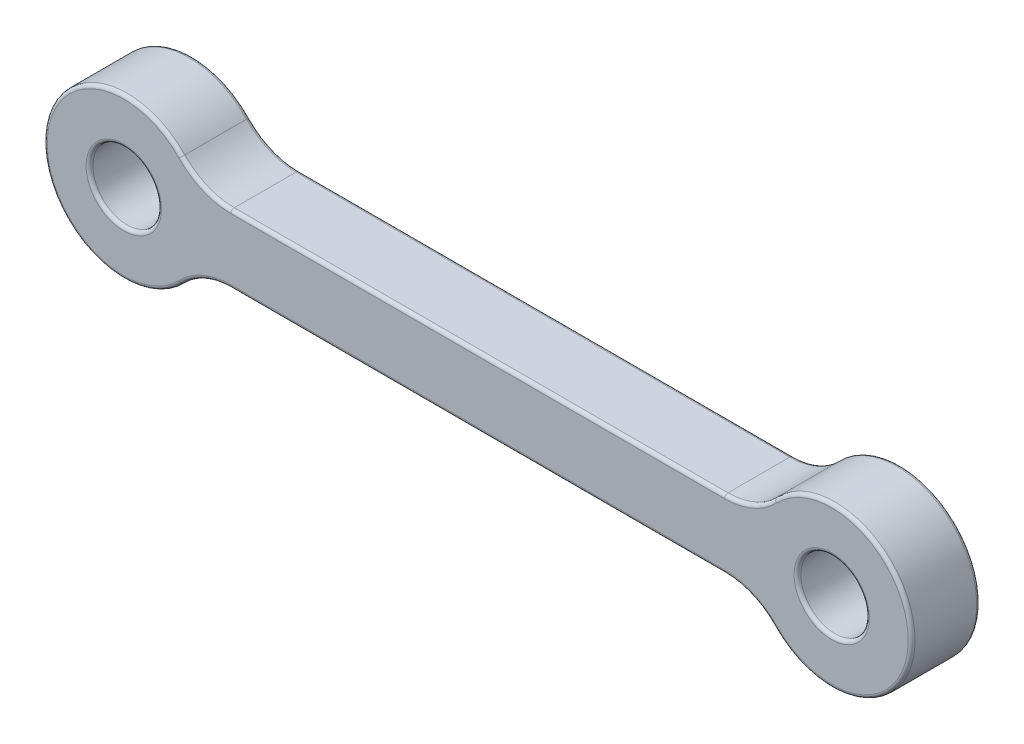
ISO-10303-21;
HEADER;
FILE_DESCRIPTION(('STEP AP214'),'2;1');
FILE_NAME('part.step','',(''),(''),'','','');
FILE_SCHEMA(('AUTOMOTIVE_DESIGN { 1 0 10303 214 1 1 1 1 }'));
ENDSEC;
DATA;
#1=APPLICATION_CONTEXT('core data for automotive mechanical design processes');
#2=APPLICATION_PROTOCOL_DEFINITION('international standard','automotive_design',2000,#1);
#3=PRODUCT_CONTEXT('',#1,'mechanical');
#4=PRODUCT('Part','Part','',(#3));
#5=PRODUCT_RELATED_PRODUCT_CATEGORY('part','',(#4));
#6=PRODUCT_DEFINITION_FORMATION('','',#4);
#7=PRODUCT_DEFINITION_CONTEXT('part definition',#1,'design');
#8=PRODUCT_DEFINITION('design','',#6,#7);
#9=PRODUCT_DEFINITION_SHAPE('','',#8);
#10=(LENGTH_UNIT() NAMED_UNIT(*) SI_UNIT(.MILLI.,.METRE.));
#11=(NAMED_UNIT(*) PLANE_ANGLE_UNIT() SI_UNIT($,.RADIAN.));
#12=(NAMED_UNIT(*) SI_UNIT($,.STERADIAN.) SOLID_ANGLE_UNIT());
#13=UNCERTAINTY_MEASURE_WITH_UNIT(LENGTH_MEASURE(1.E-05),#10,'distance_accuracy_value','');
#14=(GEOMETRIC_REPRESENTATION_CONTEXT(3) GLOBAL_UNCERTAINTY_ASSIGNED_CONTEXT((#13)) GLOBAL_UNIT_ASSIGNED_CONTEXT((#10,
#11,#12)) REPRESENTATION_CONTEXT('',''));
#15=CARTESIAN_POINT('',(0.,0.,0.));
#16=DIRECTION('',(0.,0.,1.));
#17=DIRECTION('',(1.,0.,0.));
#18=AXIS2_PLACEMENT_3D('',#15,#16,#17);
#19=CARTESIAN_POINT('',(-18.6,0.,4.8));
#20=DIRECTION('',(0.,0.,-1.));
#21=DIRECTION('',(-1.,0.,0.));
#22=AXIS2_PLACEMENT_3D('',#19,#20,#21);
#23=CYLINDRICAL_SURFACE('',#22,7.7);
#24=DIRECTION('',(0.,0.,-1.));
#25=VECTOR('',#24,1.);
#26=CARTESIAN_POINT('',(-13.0436613306707,5.33076923076923,4.8));
#27=LINE('',#26,#25);
#28=CARTESIAN_POINT('',(-13.0436613306707,5.33076923076923,4.47));
#29=VERTEX_POINT('',#28);
#30=CARTESIAN_POINT('',(-13.0436613306707,5.33076923076923,-1.47));
#31=VERTEX_POINT('',#30);
#32=EDGE_CURVE('E302',#29,#31,#27,.T.);
#33=ORIENTED_EDGE('',*,*,#32,.T.);
#34=CARTESIAN_POINT('',(-18.6,0.,-1.47));
#35=DIRECTION('',(0.,0.,1.));
#36=DIRECTION('',(1.,0.,0.));
#37=AXIS2_PLACEMENT_3D('',#34,#35,#36);
#38=CIRCLE('',#37,7.7);
#39=CARTESIAN_POINT('',(-13.0436613306707,-5.33076923076923,-1.47));
#40=VERTEX_POINT('',#39);
#41=EDGE_CURVE('E217',#31,#40,#38,.T.);
#42=ORIENTED_EDGE('',*,*,#41,.T.);
#43=DIRECTION('',(0.,0.,-1.));
#44=VECTOR('',#43,1.);
#45=CARTESIAN_POINT('',(-13.0436613306707,-5.33076923076923,4.8));
#46=LINE('',#45,#44);
#47=CARTESIAN_POINT('',(-13.0436613306707,-5.33076923076923,4.47));
#48=VERTEX_POINT('',#47);
#49=EDGE_CURVE('E296',#40,#48,#46,.F.);
#50=ORIENTED_EDGE('',*,*,#49,.T.);
#51=CARTESIAN_POINT('',(-18.6,0.,4.47));
#52=DIRECTION('',(0.,0.,1.));
#53=DIRECTION('',(1.,0.,0.));
#54=AXIS2_PLACEMENT_3D('',#51,#52,#53);
#55=CIRCLE('',#54,7.7);
#56=EDGE_CURVE('E215',#48,#29,#55,.F.);
#57=ORIENTED_EDGE('',*,*,#56,.T.);
#58=EDGE_LOOP('',(#33,#42,#50,#57));
#59=FACE_BOUND('',#58,.T.);
#60=ADVANCED_FACE('F37',(#59),#23,.T.);
#61=CARTESIAN_POINT('',(-18.6,-3.3,4.8));
#62=DIRECTION('',(0.,-1.,0.));
#63=DIRECTION('',(0.,0.,-1.));
#64=AXIS2_PLACEMENT_3D('',#61,#62,#63);
#65=PLANE('',#64);
#66=DIRECTION('',(0.,0.,-1.));
#67=VECTOR('',#66,1.);
#68=CARTESIAN_POINT('',(-8.28108532838845,-3.3,4.8));
#69=LINE('',#68,#67);
#70=CARTESIAN_POINT('',(-8.28108532838845,-3.3,4.47));
#71=VERTEX_POINT('',#70);
#72=CARTESIAN_POINT('',(-8.28108532838845,-3.3,-1.47));
#73=VERTEX_POINT('',#72);
#74=EDGE_CURVE('E298',#71,#73,#69,.T.);
#75=ORIENTED_EDGE('',*,*,#74,.T.);
#76=DIRECTION('',(-1.,0.,0.));
#77=VECTOR('',#76,1.);
#78=CARTESIAN_POINT('',(39.2810853283884,-3.3,-1.47));
#79=LINE('',#78,#77);
#80=CARTESIAN_POINT('',(39.2810853283884,-3.3,-1.47));
#81=VERTEX_POINT('',#80);
#82=EDGE_CURVE('E192',#73,#81,#79,.F.);
#83=ORIENTED_EDGE('',*,*,#82,.T.);
#84=DIRECTION('',(0.,0.,1.));
#85=VECTOR('',#84,1.);
#86=CARTESIAN_POINT('',(39.2810853283884,-3.3,4.8));
#87=LINE('',#86,#85);
#88=CARTESIAN_POINT('',(39.2810853283884,-3.3,4.47));
#89=VERTEX_POINT('',#88);
#90=EDGE_CURVE('E312',#81,#89,#87,.T.);
#91=ORIENTED_EDGE('',*,*,#90,.T.);
#92=DIRECTION('',(-1.,0.,0.));
#93=VECTOR('',#92,1.);
#94=CARTESIAN_POINT('',(-18.6,-3.3,4.47));
#95=LINE('',#94,#93);
#96=EDGE_CURVE('E190',#89,#71,#95,.T.);
#97=ORIENTED_EDGE('',*,*,#96,.T.);
#98=EDGE_LOOP('',(#75,#83,#91,#97));
#99=FACE_BOUND('',#98,.T.);
#100=ADVANCED_FACE('F341',(#99),#65,.T.);
#101=CARTESIAN_POINT('',(49.6,0.,4.8));
#102=DIRECTION('',(0.,0.,-1.));
#103=DIRECTION('',(-1.,0.,0.));
#104=AXIS2_PLACEMENT_3D('',#101,#102,#103);
#105=CYLINDRICAL_SURFACE('',#104,7.7);
#106=DIRECTION('',(0.,0.,-1.));
#107=VECTOR('',#106,1.);
#108=CARTESIAN_POINT('',(44.0436613306707,-5.33076923076923,4.8));
#109=LINE('',#108,#107);
#110=CARTESIAN_POINT('',(44.0436613306707,-5.33076923076923,4.47));
#111=VERTEX_POINT('',#110);
#112=CARTESIAN_POINT('',(44.0436613306707,-5.33076923076923,-1.47));
#113=VERTEX_POINT('',#112);
#114=EDGE_CURVE('E307',#111,#113,#109,.T.);
#115=ORIENTED_EDGE('',*,*,#114,.T.);
#116=CARTESIAN_POINT('',(49.6,0.,-1.47));
#117=DIRECTION('',(0.,0.,1.));
#118=DIRECTION('',(1.,0.,0.));
#119=AXIS2_PLACEMENT_3D('',#116,#117,#118);
#120=CIRCLE('',#119,7.7);
#121=CARTESIAN_POINT('',(44.0436613306707,5.33076923076923,-1.47));
#122=VERTEX_POINT('',#121);
#123=EDGE_CURVE('E200',#113,#122,#120,.T.);
#124=ORIENTED_EDGE('',*,*,#123,.T.);
#125=DIRECTION('',(0.,0.,-1.));
#126=VECTOR('',#125,1.);
#127=CARTESIAN_POINT('',(44.0436613306707,5.33076923076923,4.8));
#128=LINE('',#127,#126);
#129=CARTESIAN_POINT('',(44.0436613306707,5.33076923076923,4.47));
#130=VERTEX_POINT('',#129);
#131=EDGE_CURVE('E303',#122,#130,#128,.F.);
#132=ORIENTED_EDGE('',*,*,#131,.T.);
#133=CARTESIAN_POINT('',(49.6,0.,4.47));
#134=DIRECTION('',(0.,0.,1.));
#135=DIRECTION('',(1.,0.,0.));
#136=AXIS2_PLACEMENT_3D('',#133,#134,#135);
#137=CIRCLE('',#136,7.7);
#138=EDGE_CURVE('E198',#130,#111,#137,.F.);
#139=ORIENTED_EDGE('',*,*,#138,.T.);
#140=EDGE_LOOP('',(#115,#124,#132,#139));
#141=FACE_BOUND('',#140,.T.);
#142=ADVANCED_FACE('F385',(#141),#105,.T.);
#143=CARTESIAN_POINT('',(-18.6,3.3,4.8));
#144=DIRECTION('',(0.,-1.,0.));
#145=DIRECTION('',(0.,0.,-1.));
#146=AXIS2_PLACEMENT_3D('',#143,#144,#145);
#147=PLANE('',#146);
#148=DIRECTION('',(0.,0.,-1.));
#149=VECTOR('',#148,1.);
#150=CARTESIAN_POINT('',(39.2810853283884,3.3,4.8));
#151=LINE('',#150,#149);
#152=CARTESIAN_POINT('',(39.2810853283884,3.3,4.47));
#153=VERTEX_POINT('',#152);
#154=CARTESIAN_POINT('',(39.2810853283884,3.3,-1.47));
#155=VERTEX_POINT('',#154);
#156=EDGE_CURVE('E374',#153,#155,#151,.T.);
#157=ORIENTED_EDGE('',*,*,#156,.T.);
#158=DIRECTION('',(-1.,0.,0.));
#159=VECTOR('',#158,1.);
#160=CARTESIAN_POINT('',(-18.6,3.3,-1.47));
#161=LINE('',#160,#159);
#162=CARTESIAN_POINT('',(-8.28108532838845,3.3,-1.47));
#163=VERTEX_POINT('',#162);
#164=EDGE_CURVE('E209',#155,#163,#161,.T.);
#165=ORIENTED_EDGE('',*,*,#164,.T.);
#166=DIRECTION('',(0.,0.,1.));
#167=VECTOR('',#166,1.);
#168=CARTESIAN_POINT('',(-8.28108532838845,3.3,4.8));
#169=LINE('',#168,#167);
#170=CARTESIAN_POINT('',(-8.28108532838845,3.3,4.47));
#171=VERTEX_POINT('',#170);
#172=EDGE_CURVE('E258',#163,#171,#169,.T.);
#173=ORIENTED_EDGE('',*,*,#172,.T.);
#174=DIRECTION('',(-1.,0.,0.));
#175=VECTOR('',#174,1.);
#176=CARTESIAN_POINT('',(39.2810853283884,3.3,4.47));
#177=LINE('',#176,#175);
#178=EDGE_CURVE('E207',#171,#153,#177,.F.);
#179=ORIENTED_EDGE('',*,*,#178,.T.);
#180=EDGE_LOOP('',(#157,#165,#173,#179));
#181=FACE_BOUND('',#180,.T.);
#182=ADVANCED_FACE('F373',(#181),#147,.F.);
#183=CARTESIAN_POINT('',(-18.6,0.,4.8));
#184=DIRECTION('',(0.,0.,-1.));
#185=DIRECTION('',(-1.,0.,0.));
#186=AXIS2_PLACEMENT_3D('',#183,#184,#185);
#187=CYLINDRICAL_SURFACE('',#186,3.3);
#188=CARTESIAN_POINT('',(-18.6,0.,-1.47));
#189=DIRECTION('',(0.,0.,1.));
#190=DIRECTION('',(1.,0.,0.));
#191=AXIS2_PLACEMENT_3D('',#188,#189,#190);
#192=CIRCLE('',#191,3.3);
#193=CARTESIAN_POINT('',(-15.3,0.,-1.47));
#194=VERTEX_POINT('',#193);
#195=EDGE_CURVE('E222',#194,#194,#192,.F.);
#196=ORIENTED_EDGE('',*,*,#195,.T.);
#197=EDGE_LOOP('',(#196));
#198=FACE_BOUND('',#197,.T.);
#199=CARTESIAN_POINT('',(-18.6,0.,4.47));
#200=DIRECTION('',(0.,0.,1.));
#201=DIRECTION('',(1.,0.,0.));
#202=AXIS2_PLACEMENT_3D('',#199,#200,#201);
#203=CIRCLE('',#202,3.3);
#204=CARTESIAN_POINT('',(-15.3,0.,4.47));
#205=VERTEX_POINT('',#204);
#206=EDGE_CURVE('E219',#205,#205,#203,.T.);
#207=ORIENTED_EDGE('',*,*,#206,.T.);
#208=EDGE_LOOP('',(#207));
#209=FACE_BOUND('',#208,.T.);
#210=ADVANCED_FACE('F417',(#198,#209),#187,.F.);
#211=CARTESIAN_POINT('',(49.6,0.,4.8));
#212=DIRECTION('',(0.,0.,-1.));
#213=DIRECTION('',(-1.,0.,0.));
#214=AXIS2_PLACEMENT_3D('',#211,#212,#213);
#215=CYLINDRICAL_SURFACE('',#214,3.3);
#216=CARTESIAN_POINT('',(49.6,0.,-1.47));
#217=DIRECTION('',(0.,0.,1.));
#218=DIRECTION('',(1.,0.,0.));
#219=AXIS2_PLACEMENT_3D('',#216,#217,#218);
#220=CIRCLE('',#219,3.3);
#221=CARTESIAN_POINT('',(52.9,0.,-1.47));
#222=VERTEX_POINT('',#221);
#223=EDGE_CURVE('E318',#222,#222,#220,.F.);
#224=ORIENTED_EDGE('',*,*,#223,.T.);
#225=EDGE_LOOP('',(#224));
#226=FACE_BOUND('',#225,.T.);
#227=CARTESIAN_POINT('',(49.6,0.,4.47));
#228=DIRECTION('',(0.,0.,1.));
#229=DIRECTION('',(1.,0.,0.));
#230=AXIS2_PLACEMENT_3D('',#227,#228,#229);
#231=CIRCLE('',#230,3.3);
#232=CARTESIAN_POINT('',(52.9,0.,4.47));
#233=VERTEX_POINT('',#232);
#234=EDGE_CURVE('E315',#233,#233,#231,.T.);
#235=ORIENTED_EDGE('',*,*,#234,.T.);
#236=EDGE_LOOP('',(#235));
#237=FACE_BOUND('',#236,.T.);
#238=ADVANCED_FACE('F420',(#226,#237),#215,.F.);
#239=CARTESIAN_POINT('',(-18.6,0.,4.8));
#240=DIRECTION('',(0.,0.,1.));
#241=DIRECTION('',(1.,0.,0.));
#242=AXIS2_PLACEMENT_3D('',#239,#240,#241);
#243=PLANE('',#242);
#244=CARTESIAN_POINT('',(49.6,0.,4.8));
#245=DIRECTION('',(0.,0.,1.));
#246=DIRECTION('',(1.,0.,0.));
#247=AXIS2_PLACEMENT_3D('',#244,#245,#246);
#248=CIRCLE('',#247,3.63);
#249=CARTESIAN_POINT('',(53.23,0.,4.8));
#250=VERTEX_POINT('',#249);
#251=EDGE_CURVE('E11',#250,#250,#248,.F.);
#252=ORIENTED_EDGE('',*,*,#251,.T.);
#253=EDGE_LOOP('',(#252));
#254=FACE_BOUND('',#253,.T.);
#255=CARTESIAN_POINT('',(49.6,0.,4.8));
#256=DIRECTION('',(0.,0.,1.));
#257=DIRECTION('',(1.,0.,0.));
#258=AXIS2_PLACEMENT_3D('',#255,#256,#257);
#259=CIRCLE('',#258,7.37);
#260=CARTESIAN_POINT('',(44.2817901307848,-5.10230769230769,4.8));
#261=VERTEX_POINT('',#260);
#262=CARTESIAN_POINT('',(44.2817901307848,5.10230769230769,4.8));
#263=VERTEX_POINT('',#262);
#264=EDGE_CURVE('E54',#261,#263,#259,.T.);
#265=ORIENTED_EDGE('',*,*,#264,.T.);
#266=CARTESIAN_POINT('',(39.2810853283884,9.9,4.8));
#267=DIRECTION('',(0.,0.,1.));
#268=DIRECTION('',(1.,0.,0.));
#269=AXIS2_PLACEMENT_3D('',#266,#267,#268);
#270=CIRCLE('',#269,6.93);
#271=CARTESIAN_POINT('',(39.2810853283884,2.97,4.8));
#272=VERTEX_POINT('',#271);
#273=EDGE_CURVE('E46',#263,#272,#270,.F.);
#274=ORIENTED_EDGE('',*,*,#273,.T.);
#275=DIRECTION('',(-1.,0.,0.));
#276=VECTOR('',#275,1.);
#277=CARTESIAN_POINT('',(-8.28108532838845,2.97,4.8));
#278=LINE('',#277,#276);
#279=CARTESIAN_POINT('',(-8.28108532838845,2.97,4.8));
#280=VERTEX_POINT('',#279);
#281=EDGE_CURVE('E228',#272,#280,#278,.T.);
#282=ORIENTED_EDGE('',*,*,#281,.T.);
#283=CARTESIAN_POINT('',(-8.28108532838845,9.9,4.8));
#284=DIRECTION('',(0.,0.,1.));
#285=DIRECTION('',(1.,0.,0.));
#286=AXIS2_PLACEMENT_3D('',#283,#284,#285);
#287=CIRCLE('',#286,6.93);
#288=CARTESIAN_POINT('',(-13.2817901307848,5.10230769230769,4.8));
#289=VERTEX_POINT('',#288);
#290=EDGE_CURVE('E230',#280,#289,#287,.F.);
#291=ORIENTED_EDGE('',*,*,#290,.T.);
#292=CARTESIAN_POINT('',(-18.6,0.,4.8));
#293=DIRECTION('',(0.,0.,1.));
#294=DIRECTION('',(1.,0.,0.));
#295=AXIS2_PLACEMENT_3D('',#292,#293,#294);
#296=CIRCLE('',#295,7.37);
#297=CARTESIAN_POINT('',(-13.2817901307848,-5.10230769230769,4.8));
#298=VERTEX_POINT('',#297);
#299=EDGE_CURVE('E232',#289,#298,#296,.T.);
#300=ORIENTED_EDGE('',*,*,#299,.T.);
#301=CARTESIAN_POINT('',(-8.28108532838845,-9.9,4.8));
#302=DIRECTION('',(0.,0.,1.));
#303=DIRECTION('',(1.,0.,0.));
#304=AXIS2_PLACEMENT_3D('',#301,#302,#303);
#305=CIRCLE('',#304,6.93);
#306=CARTESIAN_POINT('',(-8.28108532838845,-2.97,4.8));
#307=VERTEX_POINT('',#306);
#308=EDGE_CURVE('E234',#298,#307,#305,.F.);
#309=ORIENTED_EDGE('',*,*,#308,.T.);
#310=DIRECTION('',(-1.,0.,0.));
#311=VECTOR('',#310,1.);
#312=CARTESIAN_POINT('',(-18.6,-2.97,4.8));
#313=LINE('',#312,#311);
#314=CARTESIAN_POINT('',(39.2810853283884,-2.97,4.8));
#315=VERTEX_POINT('',#314);
#316=EDGE_CURVE('E236',#307,#315,#313,.F.);
#317=ORIENTED_EDGE('',*,*,#316,.T.);
#318=CARTESIAN_POINT('',(39.2810853283884,-9.9,4.8));
#319=DIRECTION('',(0.,0.,1.));
#320=DIRECTION('',(1.,0.,0.));
#321=AXIS2_PLACEMENT_3D('',#318,#319,#320);
#322=CIRCLE('',#321,6.93);
#323=EDGE_CURVE('E59',#315,#261,#322,.F.);
#324=ORIENTED_EDGE('',*,*,#323,.T.);
#325=EDGE_LOOP('',(#265,#274,#282,#291,#300,#309,#317,#324));
#326=FACE_BOUND('',#325,.T.);
#327=CARTESIAN_POINT('',(-18.6,0.,4.8));
#328=DIRECTION('',(0.,0.,1.));
#329=DIRECTION('',(1.,0.,0.));
#330=AXIS2_PLACEMENT_3D('',#327,#328,#329);
#331=CIRCLE('',#330,3.63);
#332=CARTESIAN_POINT('',(-14.97,0.,4.8));
#333=VERTEX_POINT('',#332);
#334=EDGE_CURVE('E225',#333,#333,#331,.F.);
#335=ORIENTED_EDGE('',*,*,#334,.T.);
#336=EDGE_LOOP('',(#335));
#337=FACE_BOUND('',#336,.T.);
#338=ADVANCED_FACE('F358',(#254,#326,#337),#243,.T.);
#339=CARTESIAN_POINT('',(-18.6,0.,-1.8));
#340=DIRECTION('',(0.,0.,1.));
#341=DIRECTION('',(1.,0.,0.));
#342=AXIS2_PLACEMENT_3D('',#339,#340,#341);
#343=PLANE('',#342);
#344=CARTESIAN_POINT('',(49.6,0.,-1.8));
#345=DIRECTION('',(0.,0.,1.));
#346=DIRECTION('',(1.,0.,0.));
#347=AXIS2_PLACEMENT_3D('',#344,#345,#346);
#348=CIRCLE('',#347,3.63);
#349=CARTESIAN_POINT('',(53.23,0.,-1.8));
#350=VERTEX_POINT('',#349);
#351=EDGE_CURVE('E179',#350,#350,#348,.T.);
#352=ORIENTED_EDGE('',*,*,#351,.T.);
#353=EDGE_LOOP('',(#352));
#354=FACE_BOUND('',#353,.T.);
#355=DIRECTION('',(-1.,0.,0.));
#356=VECTOR('',#355,1.);
#357=CARTESIAN_POINT('',(-8.28108532838845,-2.97,-1.8));
#358=LINE('',#357,#356);
#359=CARTESIAN_POINT('',(39.2810853283884,-2.97,-1.8));
#360=VERTEX_POINT('',#359);
#361=CARTESIAN_POINT('',(-8.28108532838845,-2.97,-1.8));
#362=VERTEX_POINT('',#361);
#363=EDGE_CURVE('E177',#360,#362,#358,.T.);
#364=ORIENTED_EDGE('',*,*,#363,.T.);
#365=CARTESIAN_POINT('',(-8.28108532838845,-9.9,-1.8));
#366=DIRECTION('',(0.,0.,1.));
#367=DIRECTION('',(1.,0.,0.));
#368=AXIS2_PLACEMENT_3D('',#365,#366,#367);
#369=CIRCLE('',#368,6.93);
#370=CARTESIAN_POINT('',(-13.2817901307848,-5.10230769230769,-1.8));
#371=VERTEX_POINT('',#370);
#372=EDGE_CURVE('E157',#362,#371,#369,.T.);
#373=ORIENTED_EDGE('',*,*,#372,.T.);
#374=CARTESIAN_POINT('',(-18.6,0.,-1.8));
#375=DIRECTION('',(0.,0.,1.));
#376=DIRECTION('',(1.,0.,0.));
#377=AXIS2_PLACEMENT_3D('',#374,#375,#376);
#378=CIRCLE('',#377,7.37);
#379=CARTESIAN_POINT('',(-13.2817901307848,5.10230769230769,-1.8));
#380=VERTEX_POINT('',#379);
#381=EDGE_CURVE('E165',#371,#380,#378,.F.);
#382=ORIENTED_EDGE('',*,*,#381,.T.);
#383=CARTESIAN_POINT('',(-8.28108532838845,9.9,-1.8));
#384=DIRECTION('',(0.,0.,1.));
#385=DIRECTION('',(1.,0.,0.));
#386=AXIS2_PLACEMENT_3D('',#383,#384,#385);
#387=CIRCLE('',#386,6.93);
#388=CARTESIAN_POINT('',(-8.28108532838845,2.97,-1.8));
#389=VERTEX_POINT('',#388);
#390=EDGE_CURVE('E171',#380,#389,#387,.T.);
#391=ORIENTED_EDGE('',*,*,#390,.T.);
#392=DIRECTION('',(-1.,0.,0.));
#393=VECTOR('',#392,1.);
#394=CARTESIAN_POINT('',(-18.6,2.97,-1.8));
#395=LINE('',#394,#393);
#396=CARTESIAN_POINT('',(39.2810853283884,2.97,-1.8));
#397=VERTEX_POINT('',#396);
#398=EDGE_CURVE('E324',#389,#397,#395,.F.);
#399=ORIENTED_EDGE('',*,*,#398,.T.);
#400=CARTESIAN_POINT('',(39.2810853283884,9.9,-1.8));
#401=DIRECTION('',(0.,0.,1.));
#402=DIRECTION('',(1.,0.,0.));
#403=AXIS2_PLACEMENT_3D('',#400,#401,#402);
#404=CIRCLE('',#403,6.93);
#405=CARTESIAN_POINT('',(44.2817901307848,5.10230769230769,-1.8));
#406=VERTEX_POINT('',#405);
#407=EDGE_CURVE('E326',#397,#406,#404,.T.);
#408=ORIENTED_EDGE('',*,*,#407,.T.);
#409=CARTESIAN_POINT('',(49.6,0.,-1.8));
#410=DIRECTION('',(0.,0.,1.));
#411=DIRECTION('',(1.,0.,0.));
#412=AXIS2_PLACEMENT_3D('',#409,#410,#411);
#413=CIRCLE('',#412,7.37);
#414=CARTESIAN_POINT('',(44.2817901307848,-5.10230769230769,-1.8));
#415=VERTEX_POINT('',#414);
#416=EDGE_CURVE('E328',#406,#415,#413,.F.);
#417=ORIENTED_EDGE('',*,*,#416,.T.);
#418=CARTESIAN_POINT('',(39.2810853283884,-9.9,-1.8));
#419=DIRECTION('',(0.,0.,1.));
#420=DIRECTION('',(1.,0.,0.));
#421=AXIS2_PLACEMENT_3D('',#418,#419,#420);
#422=CIRCLE('',#421,6.93);
#423=EDGE_CURVE('E184',#415,#360,#422,.T.);
#424=ORIENTED_EDGE('',*,*,#423,.T.);
#425=EDGE_LOOP('',(#364,#373,#382,#391,#399,#408,#417,#424));
#426=FACE_BOUND('',#425,.T.);
#427=CARTESIAN_POINT('',(-18.6,0.,-1.8));
#428=DIRECTION('',(0.,0.,1.));
#429=DIRECTION('',(1.,0.,0.));
#430=AXIS2_PLACEMENT_3D('',#427,#428,#429);
#431=CIRCLE('',#430,3.63);
#432=CARTESIAN_POINT('',(-14.97,0.,-1.8));
#433=VERTEX_POINT('',#432);
#434=EDGE_CURVE('E172',#433,#433,#431,.T.);
#435=ORIENTED_EDGE('',*,*,#434,.T.);
#436=EDGE_LOOP('',(#435));
#437=FACE_BOUND('',#436,.T.);
#438=ADVANCED_FACE('F174',(#354,#426,#437),#343,.F.);
#439=CARTESIAN_POINT('',(39.2810853283884,9.9,4.8));
#440=DIRECTION('',(0.,0.,-1.));
#441=DIRECTION('',(-1.,0.,0.));
#442=AXIS2_PLACEMENT_3D('',#439,#440,#441);
#443=CYLINDRICAL_SURFACE('',#442,6.6);
#444=ORIENTED_EDGE('',*,*,#131,.F.);
#445=CARTESIAN_POINT('',(39.2810853283884,9.9,-1.47));
#446=DIRECTION('',(0.,0.,1.));
#447=DIRECTION('',(1.,0.,0.));
#448=AXIS2_PLACEMENT_3D('',#445,#446,#447);
#449=CIRCLE('',#448,6.6);
#450=EDGE_CURVE('E205',#122,#155,#449,.F.);
#451=ORIENTED_EDGE('',*,*,#450,.T.);
#452=ORIENTED_EDGE('',*,*,#156,.F.);
#453=CARTESIAN_POINT('',(39.2810853283884,9.9,4.47));
#454=DIRECTION('',(0.,0.,1.));
#455=DIRECTION('',(1.,0.,0.));
#456=AXIS2_PLACEMENT_3D('',#453,#454,#455);
#457=CIRCLE('',#456,6.6);
#458=EDGE_CURVE('E202',#153,#130,#457,.T.);
#459=ORIENTED_EDGE('',*,*,#458,.T.);
#460=EDGE_LOOP('',(#444,#451,#452,#459));
#461=FACE_BOUND('',#460,.T.);
#462=ADVANCED_FACE('F379',(#461),#443,.F.);
#463=CARTESIAN_POINT('',(-8.28108532838845,9.9,4.8));
#464=DIRECTION('',(0.,0.,-1.));
#465=DIRECTION('',(-1.,0.,0.));
#466=AXIS2_PLACEMENT_3D('',#463,#464,#465);
#467=CYLINDRICAL_SURFACE('',#466,6.6);
#468=ORIENTED_EDGE('',*,*,#172,.F.);
#469=CARTESIAN_POINT('',(-8.28108532838845,9.9,-1.47));
#470=DIRECTION('',(0.,0.,1.));
#471=DIRECTION('',(1.,0.,0.));
#472=AXIS2_PLACEMENT_3D('',#469,#470,#471);
#473=CIRCLE('',#472,6.6);
#474=EDGE_CURVE('E213',#163,#31,#473,.F.);
#475=ORIENTED_EDGE('',*,*,#474,.T.);
#476=ORIENTED_EDGE('',*,*,#32,.F.);
#477=CARTESIAN_POINT('',(-8.28108532838845,9.9,4.47));
#478=DIRECTION('',(0.,0.,1.));
#479=DIRECTION('',(1.,0.,0.));
#480=AXIS2_PLACEMENT_3D('',#477,#478,#479);
#481=CIRCLE('',#480,6.6);
#482=EDGE_CURVE('E211',#29,#171,#481,.T.);
#483=ORIENTED_EDGE('',*,*,#482,.T.);
#484=EDGE_LOOP('',(#468,#475,#476,#483));
#485=FACE_BOUND('',#484,.T.);
#486=ADVANCED_FACE('F399',(#485),#467,.F.);
#487=CARTESIAN_POINT('',(39.2810853283884,-9.9,4.8));
#488=DIRECTION('',(0.,0.,-1.));
#489=DIRECTION('',(-1.,0.,0.));
#490=AXIS2_PLACEMENT_3D('',#487,#488,#489);
#491=CYLINDRICAL_SURFACE('',#490,6.6);
#492=ORIENTED_EDGE('',*,*,#90,.F.);
#493=CARTESIAN_POINT('',(39.2810853283884,-9.9,-1.47));
#494=DIRECTION('',(0.,0.,1.));
#495=DIRECTION('',(1.,0.,0.));
#496=AXIS2_PLACEMENT_3D('',#493,#494,#495);
#497=CIRCLE('',#496,6.6);
#498=EDGE_CURVE('E196',#81,#113,#497,.F.);
#499=ORIENTED_EDGE('',*,*,#498,.T.);
#500=ORIENTED_EDGE('',*,*,#114,.F.);
#501=CARTESIAN_POINT('',(39.2810853283884,-9.9,4.47));
#502=DIRECTION('',(0.,0.,1.));
#503=DIRECTION('',(1.,0.,0.));
#504=AXIS2_PLACEMENT_3D('',#501,#502,#503);
#505=CIRCLE('',#504,6.6);
#506=EDGE_CURVE('E194',#111,#89,#505,.T.);
#507=ORIENTED_EDGE('',*,*,#506,.T.);
#508=EDGE_LOOP('',(#492,#499,#500,#507));
#509=FACE_BOUND('',#508,.T.);
#510=ADVANCED_FACE('F343',(#509),#491,.F.);
#511=CARTESIAN_POINT('',(-8.28108532838845,-9.9,4.8));
#512=DIRECTION('',(0.,0.,-1.));
#513=DIRECTION('',(-1.,0.,0.));
#514=AXIS2_PLACEMENT_3D('',#511,#512,#513);
#515=CYLINDRICAL_SURFACE('',#514,6.6);
#516=ORIENTED_EDGE('',*,*,#49,.F.);
#517=CARTESIAN_POINT('',(-8.28108532838845,-9.9,-1.47));
#518=DIRECTION('',(0.,0.,1.));
#519=DIRECTION('',(1.,0.,0.));
#520=AXIS2_PLACEMENT_3D('',#517,#518,#519);
#521=CIRCLE('',#520,6.6);
#522=EDGE_CURVE('E159',#40,#73,#521,.F.);
#523=ORIENTED_EDGE('',*,*,#522,.T.);
#524=ORIENTED_EDGE('',*,*,#74,.F.);
#525=CARTESIAN_POINT('',(-8.28108532838845,-9.9,4.47));
#526=DIRECTION('',(0.,0.,1.));
#527=DIRECTION('',(1.,0.,0.));
#528=AXIS2_PLACEMENT_3D('',#525,#526,#527);
#529=CIRCLE('',#528,6.6);
#530=EDGE_CURVE('E182',#71,#48,#529,.T.);
#531=ORIENTED_EDGE('',*,*,#530,.T.);
#532=EDGE_LOOP('',(#516,#523,#524,#531));
#533=FACE_BOUND('',#532,.T.);
#534=ADVANCED_FACE('F295',(#533),#515,.F.);
#535=CARTESIAN_POINT('',(49.6,0.,-1.47));
#536=DIRECTION('',(0.,0.,1.));
#537=DIRECTION('',(1.,0.,0.));
#538=AXIS2_PLACEMENT_3D('',#535,#536,#537);
#539=TOROIDAL_SURFACE('',#538,3.63,0.33);
#540=ORIENTED_EDGE('',*,*,#351,.F.);
#541=EDGE_LOOP('',(#540));
#542=FACE_BOUND('',#541,.T.);
#543=ORIENTED_EDGE('',*,*,#223,.F.);
#544=EDGE_LOOP('',(#543));
#545=FACE_BOUND('',#544,.T.);
#546=ADVANCED_FACE('F430',(#542,#545),#539,.T.);
#547=CARTESIAN_POINT('',(39.2810853283884,9.9,-1.47));
#548=DIRECTION('',(0.,0.,1.));
#549=DIRECTION('',(1.,0.,0.));
#550=AXIS2_PLACEMENT_3D('',#547,#548,#549);
#551=TOROIDAL_SURFACE('',#550,6.93,0.33);
#552=CARTESIAN_POINT('',(39.2810853283884,2.97,-1.47));
#553=DIRECTION('',(-1.,0.,0.));
#554=DIRECTION('',(0.,0.,1.));
#555=AXIS2_PLACEMENT_3D('',#552,#553,#554);
#556=CIRCLE('',#555,0.33);
#557=EDGE_CURVE('E252',#155,#397,#556,.T.);
#558=ORIENTED_EDGE('',*,*,#557,.F.);
#559=ORIENTED_EDGE('',*,*,#450,.F.);
#560=CARTESIAN_POINT('',(44.2817901307848,5.10230769230769,-1.47));
#561=DIRECTION('',(0.6923076923077,0.721602424588213,0.));
#562=DIRECTION('',(-0.721602424588213,0.6923076923077,0.));
#563=AXIS2_PLACEMENT_3D('',#560,#561,#562);
#564=CIRCLE('',#563,0.33);
#565=EDGE_CURVE('E255',#406,#122,#564,.T.);
#566=ORIENTED_EDGE('',*,*,#565,.F.);
#567=ORIENTED_EDGE('',*,*,#407,.F.);
#568=EDGE_LOOP('',(#558,#559,#566,#567));
#569=FACE_BOUND('',#568,.T.);
#570=ADVANCED_FACE('F391',(#569),#551,.T.);
#571=CARTESIAN_POINT('',(49.6,0.,-1.47));
#572=DIRECTION('',(0.,0.,1.));
#573=DIRECTION('',(1.,0.,0.));
#574=AXIS2_PLACEMENT_3D('',#571,#572,#573);
#575=TOROIDAL_SURFACE('',#574,7.37,0.33);
#576=ORIENTED_EDGE('',*,*,#565,.T.);
#577=ORIENTED_EDGE('',*,*,#123,.F.);
#578=CARTESIAN_POINT('',(44.2817901307848,-5.10230769230769,-1.47));
#579=DIRECTION('',(-0.692307692307698,0.721602424588214,0.));
#580=DIRECTION('',(-0.721602424588214,-0.692307692307698,0.));
#581=AXIS2_PLACEMENT_3D('',#578,#579,#580);
#582=CIRCLE('',#581,0.33);
#583=EDGE_CURVE('E249',#415,#113,#582,.T.);
#584=ORIENTED_EDGE('',*,*,#583,.F.);
#585=ORIENTED_EDGE('',*,*,#416,.F.);
#586=EDGE_LOOP('',(#576,#577,#584,#585));
#587=FACE_BOUND('',#586,.T.);
#588=ADVANCED_FACE('F387',(#587),#575,.T.);
#589=CARTESIAN_POINT('',(-18.6,2.97,-1.47));
#590=DIRECTION('',(-1.,0.,0.));
#591=DIRECTION('',(0.,0.,1.));
#592=AXIS2_PLACEMENT_3D('',#589,#590,#591);
#593=CYLINDRICAL_SURFACE('',#592,0.33);
#594=ORIENTED_EDGE('',*,*,#557,.T.);
#595=ORIENTED_EDGE('',*,*,#398,.F.);
#596=CARTESIAN_POINT('',(-8.28108532838845,2.97,-1.47));
#597=DIRECTION('',(-1.,0.,0.));
#598=DIRECTION('',(0.,0.,1.));
#599=AXIS2_PLACEMENT_3D('',#596,#597,#598);
#600=CIRCLE('',#599,0.33);
#601=EDGE_CURVE('E246',#163,#389,#600,.T.);
#602=ORIENTED_EDGE('',*,*,#601,.F.);
#603=ORIENTED_EDGE('',*,*,#164,.F.);
#604=EDGE_LOOP('',(#594,#595,#602,#603));
#605=FACE_BOUND('',#604,.T.);
#606=ADVANCED_FACE('F396',(#605),#593,.T.);
#607=CARTESIAN_POINT('',(39.2810853283884,-9.9,-1.47));
#608=DIRECTION('',(0.,0.,1.));
#609=DIRECTION('',(1.,0.,0.));
#610=AXIS2_PLACEMENT_3D('',#607,#608,#609);
#611=TOROIDAL_SURFACE('',#610,6.93,0.33);
#612=ORIENTED_EDGE('',*,*,#583,.T.);
#613=ORIENTED_EDGE('',*,*,#498,.F.);
#614=CARTESIAN_POINT('',(39.2810853283884,-2.97,-1.47));
#615=DIRECTION('',(-1.,0.,0.));
#616=DIRECTION('',(0.,0.,1.));
#617=AXIS2_PLACEMENT_3D('',#614,#615,#616);
#618=CIRCLE('',#617,0.33);
#619=EDGE_CURVE('E243',#360,#81,#618,.T.);
#620=ORIENTED_EDGE('',*,*,#619,.F.);
#621=ORIENTED_EDGE('',*,*,#423,.F.);
#622=EDGE_LOOP('',(#612,#613,#620,#621));
#623=FACE_BOUND('',#622,.T.);
#624=ADVANCED_FACE('F335',(#623),#611,.T.);
#625=CARTESIAN_POINT('',(-8.28108532838845,9.9,-1.47));
#626=DIRECTION('',(0.,0.,1.));
#627=DIRECTION('',(1.,0.,0.));
#628=AXIS2_PLACEMENT_3D('',#625,#626,#627);
#629=TOROIDAL_SURFACE('',#628,6.93,0.33);
#630=ORIENTED_EDGE('',*,*,#601,.T.);
#631=ORIENTED_EDGE('',*,*,#390,.F.);
#632=CARTESIAN_POINT('',(-13.2817901307848,5.10230769230769,-1.47));
#633=DIRECTION('',(-0.692307692307693,0.72160242458822,0.));
#634=DIRECTION('',(-0.72160242458822,-0.692307692307693,0.));
#635=AXIS2_PLACEMENT_3D('',#632,#633,#634);
#636=CIRCLE('',#635,0.33);
#637=EDGE_CURVE('E168',#31,#380,#636,.T.);
#638=ORIENTED_EDGE('',*,*,#637,.F.);
#639=ORIENTED_EDGE('',*,*,#474,.F.);
#640=EDGE_LOOP('',(#630,#631,#638,#639));
#641=FACE_BOUND('',#640,.T.);
#642=ADVANCED_FACE('F441',(#641),#629,.T.);
#643=CARTESIAN_POINT('',(-18.6,-2.97,-1.47));
#644=DIRECTION('',(1.,0.,0.));
#645=DIRECTION('',(0.,0.,-1.));
#646=AXIS2_PLACEMENT_3D('',#643,#644,#645);
#647=CYLINDRICAL_SURFACE('',#646,0.33);
#648=ORIENTED_EDGE('',*,*,#619,.T.);
#649=ORIENTED_EDGE('',*,*,#82,.F.);
#650=CARTESIAN_POINT('',(-8.28108532838845,-2.97,-1.47));
#651=DIRECTION('',(-1.,0.,0.));
#652=DIRECTION('',(0.,0.,1.));
#653=AXIS2_PLACEMENT_3D('',#650,#651,#652);
#654=CIRCLE('',#653,0.33);
#655=EDGE_CURVE('E162',#362,#73,#654,.T.);
#656=ORIENTED_EDGE('',*,*,#655,.F.);
#657=ORIENTED_EDGE('',*,*,#363,.F.);
#658=EDGE_LOOP('',(#648,#649,#656,#657));
#659=FACE_BOUND('',#658,.T.);
#660=ADVANCED_FACE('F338',(#659),#647,.T.);
#661=CARTESIAN_POINT('',(-18.6,0.,-1.47));
#662=DIRECTION('',(0.,0.,1.));
#663=DIRECTION('',(1.,0.,0.));
#664=AXIS2_PLACEMENT_3D('',#661,#662,#663);
#665=TOROIDAL_SURFACE('',#664,7.37,0.33);
#666=ORIENTED_EDGE('',*,*,#637,.T.);
#667=ORIENTED_EDGE('',*,*,#381,.F.);
#668=CARTESIAN_POINT('',(-13.2817901307848,-5.10230769230769,-1.47));
#669=DIRECTION('',(0.692307692307693,0.72160242458822,0.));
#670=DIRECTION('',(-0.72160242458822,0.692307692307693,0.));
#671=AXIS2_PLACEMENT_3D('',#668,#669,#670);
#672=CIRCLE('',#671,0.33);
#673=EDGE_CURVE('E153',#40,#371,#672,.T.);
#674=ORIENTED_EDGE('',*,*,#673,.F.);
#675=ORIENTED_EDGE('',*,*,#41,.F.);
#676=EDGE_LOOP('',(#666,#667,#674,#675));
#677=FACE_BOUND('',#676,.T.);
#678=ADVANCED_FACE('F166',(#677),#665,.T.);
#679=CARTESIAN_POINT('',(-8.28108532838845,-9.9,-1.47));
#680=DIRECTION('',(0.,0.,1.));
#681=DIRECTION('',(1.,0.,0.));
#682=AXIS2_PLACEMENT_3D('',#679,#680,#681);
#683=TOROIDAL_SURFACE('',#682,6.93,0.33);
#684=ORIENTED_EDGE('',*,*,#655,.T.);
#685=ORIENTED_EDGE('',*,*,#522,.F.);
#686=ORIENTED_EDGE('',*,*,#673,.T.);
#687=ORIENTED_EDGE('',*,*,#372,.F.);
#688=EDGE_LOOP('',(#684,#685,#686,#687));
#689=FACE_BOUND('',#688,.T.);
#690=ADVANCED_FACE('F155',(#689),#683,.T.);
#691=CARTESIAN_POINT('',(-18.6,0.,-1.47));
#692=DIRECTION('',(0.,0.,1.));
#693=DIRECTION('',(1.,0.,0.));
#694=AXIS2_PLACEMENT_3D('',#691,#692,#693);
#695=TOROIDAL_SURFACE('',#694,3.63,0.33);
#696=ORIENTED_EDGE('',*,*,#195,.F.);
#697=EDGE_LOOP('',(#696));
#698=FACE_BOUND('',#697,.T.);
#699=ORIENTED_EDGE('',*,*,#434,.F.);
#700=EDGE_LOOP('',(#699));
#701=FACE_BOUND('',#700,.T.);
#702=ADVANCED_FACE('F436',(#698,#701),#695,.T.);
#703=CARTESIAN_POINT('',(49.6,0.,4.47));
#704=DIRECTION('',(0.,0.,1.));
#705=DIRECTION('',(1.,0.,0.));
#706=AXIS2_PLACEMENT_3D('',#703,#704,#705);
#707=TOROIDAL_SURFACE('',#706,3.63,0.33);
#708=ORIENTED_EDGE('',*,*,#234,.F.);
#709=EDGE_LOOP('',(#708));
#710=FACE_BOUND('',#709,.T.);
#711=ORIENTED_EDGE('',*,*,#251,.F.);
#712=EDGE_LOOP('',(#711));
#713=FACE_BOUND('',#712,.T.);
#714=ADVANCED_FACE('F455',(#710,#713),#707,.T.);
#715=CARTESIAN_POINT('',(-8.28108532838845,-9.9,4.47));
#716=DIRECTION('',(0.,0.,1.));
#717=DIRECTION('',(1.,0.,0.));
#718=AXIS2_PLACEMENT_3D('',#715,#716,#717);
#719=TOROIDAL_SURFACE('',#718,6.93,0.33);
#720=CARTESIAN_POINT('',(-13.2817901307848,-5.10230769230769,4.47));
#721=DIRECTION('',(-0.692307692307693,-0.72160242458822,0.));
#722=DIRECTION('',(0.72160242458822,-0.692307692307693,0.));
#723=AXIS2_PLACEMENT_3D('',#720,#721,#722);
#724=CIRCLE('',#723,0.33);
#725=EDGE_CURVE('E274',#48,#298,#724,.T.);
#726=ORIENTED_EDGE('',*,*,#725,.F.);
#727=ORIENTED_EDGE('',*,*,#530,.F.);
#728=CARTESIAN_POINT('',(-8.28108532838845,-2.97,4.47));
#729=DIRECTION('',(1.,0.,0.));
#730=DIRECTION('',(0.,0.,-1.));
#731=AXIS2_PLACEMENT_3D('',#728,#729,#730);
#732=CIRCLE('',#731,0.33);
#733=EDGE_CURVE('E41',#307,#71,#732,.T.);
#734=ORIENTED_EDGE('',*,*,#733,.F.);
#735=ORIENTED_EDGE('',*,*,#308,.F.);
#736=EDGE_LOOP('',(#726,#727,#734,#735));
#737=FACE_BOUND('',#736,.T.);
#738=ADVANCED_FACE('F290',(#737),#719,.T.);
#739=CARTESIAN_POINT('',(-18.6,-2.97,4.47));
#740=DIRECTION('',(-1.,0.,0.));
#741=DIRECTION('',(0.,0.,1.));
#742=AXIS2_PLACEMENT_3D('',#739,#740,#741);
#743=CYLINDRICAL_SURFACE('',#742,0.33);
#744=ORIENTED_EDGE('',*,*,#733,.T.);
#745=ORIENTED_EDGE('',*,*,#96,.F.);
#746=CARTESIAN_POINT('',(39.2810853283884,-2.97,4.47));
#747=DIRECTION('',(1.,0.,0.));
#748=DIRECTION('',(0.,0.,-1.));
#749=AXIS2_PLACEMENT_3D('',#746,#747,#748);
#750=CIRCLE('',#749,0.33);
#751=EDGE_CURVE('E272',#315,#89,#750,.T.);
#752=ORIENTED_EDGE('',*,*,#751,.F.);
#753=ORIENTED_EDGE('',*,*,#316,.F.);
#754=EDGE_LOOP('',(#744,#745,#752,#753));
#755=FACE_BOUND('',#754,.T.);
#756=ADVANCED_FACE('F285',(#755),#743,.T.);
#757=CARTESIAN_POINT('',(-18.6,0.,4.47));
#758=DIRECTION('',(0.,0.,1.));
#759=DIRECTION('',(1.,0.,0.));
#760=AXIS2_PLACEMENT_3D('',#757,#758,#759);
#761=TOROIDAL_SURFACE('',#760,7.37,0.33);
#762=ORIENTED_EDGE('',*,*,#725,.T.);
#763=ORIENTED_EDGE('',*,*,#299,.F.);
#764=CARTESIAN_POINT('',(-13.2817901307848,5.10230769230769,4.47));
#765=DIRECTION('',(0.692307692307693,-0.72160242458822,0.));
#766=DIRECTION('',(0.72160242458822,0.692307692307693,0.));
#767=AXIS2_PLACEMENT_3D('',#764,#765,#766);
#768=CIRCLE('',#767,0.33);
#769=EDGE_CURVE('E269',#29,#289,#768,.T.);
#770=ORIENTED_EDGE('',*,*,#769,.F.);
#771=ORIENTED_EDGE('',*,*,#56,.F.);
#772=EDGE_LOOP('',(#762,#763,#770,#771));
#773=FACE_BOUND('',#772,.T.);
#774=ADVANCED_FACE('F400',(#773),#761,.T.);
#775=CARTESIAN_POINT('',(39.2810853283884,-9.9,4.47));
#776=DIRECTION('',(0.,0.,1.));
#777=DIRECTION('',(1.,0.,0.));
#778=AXIS2_PLACEMENT_3D('',#775,#776,#777);
#779=TOROIDAL_SURFACE('',#778,6.93,0.33);
#780=ORIENTED_EDGE('',*,*,#751,.T.);
#781=ORIENTED_EDGE('',*,*,#506,.F.);
#782=CARTESIAN_POINT('',(44.2817901307848,-5.10230769230769,4.47));
#783=DIRECTION('',(0.692307692307703,-0.72160242458821,0.));
#784=DIRECTION('',(0.72160242458821,0.692307692307703,0.));
#785=AXIS2_PLACEMENT_3D('',#782,#783,#784);
#786=CIRCLE('',#785,0.33);
#787=EDGE_CURVE('E266',#261,#111,#786,.T.);
#788=ORIENTED_EDGE('',*,*,#787,.F.);
#789=ORIENTED_EDGE('',*,*,#323,.F.);
#790=EDGE_LOOP('',(#780,#781,#788,#789));
#791=FACE_BOUND('',#790,.T.);
#792=ADVANCED_FACE('F348',(#791),#779,.T.);
#793=CARTESIAN_POINT('',(-8.28108532838845,9.9,4.47));
#794=DIRECTION('',(0.,0.,1.));
#795=DIRECTION('',(1.,0.,0.));
#796=AXIS2_PLACEMENT_3D('',#793,#794,#795);
#797=TOROIDAL_SURFACE('',#796,6.93,0.33);
#798=ORIENTED_EDGE('',*,*,#769,.T.);
#799=ORIENTED_EDGE('',*,*,#290,.F.);
#800=CARTESIAN_POINT('',(-8.28108532838845,2.97,4.47));
#801=DIRECTION('',(1.,0.,0.));
#802=DIRECTION('',(0.,0.,-1.));
#803=AXIS2_PLACEMENT_3D('',#800,#801,#802);
#804=CIRCLE('',#803,0.33);
#805=EDGE_CURVE('E263',#171,#280,#804,.T.);
#806=ORIENTED_EDGE('',*,*,#805,.F.);
#807=ORIENTED_EDGE('',*,*,#482,.F.);
#808=EDGE_LOOP('',(#798,#799,#806,#807));
#809=FACE_BOUND('',#808,.T.);
#810=ADVANCED_FACE('F364',(#809),#797,.T.);
#811=CARTESIAN_POINT('',(49.6,0.,4.47));
#812=DIRECTION('',(0.,0.,1.));
#813=DIRECTION('',(1.,0.,0.));
#814=AXIS2_PLACEMENT_3D('',#811,#812,#813);
#815=TOROIDAL_SURFACE('',#814,7.37,0.33);
#816=ORIENTED_EDGE('',*,*,#787,.T.);
#817=ORIENTED_EDGE('',*,*,#138,.F.);
#818=CARTESIAN_POINT('',(44.2817901307848,5.10230769230769,4.47));
#819=DIRECTION('',(-0.692307692307701,-0.721602424588211,0.));
#820=DIRECTION('',(0.721602424588211,-0.692307692307701,0.));
#821=AXIS2_PLACEMENT_3D('',#818,#819,#820);
#822=CIRCLE('',#821,0.33);
#823=EDGE_CURVE('E261',#263,#130,#822,.T.);
#824=ORIENTED_EDGE('',*,*,#823,.F.);
#825=ORIENTED_EDGE('',*,*,#264,.F.);
#826=EDGE_LOOP('',(#816,#817,#824,#825));
#827=FACE_BOUND('',#826,.T.);
#828=ADVANCED_FACE('F351',(#827),#815,.T.);
#829=CARTESIAN_POINT('',(-18.6,2.97,4.47));
#830=DIRECTION('',(1.,0.,0.));
#831=DIRECTION('',(0.,0.,-1.));
#832=AXIS2_PLACEMENT_3D('',#829,#830,#831);
#833=CYLINDRICAL_SURFACE('',#832,0.33);
#834=ORIENTED_EDGE('',*,*,#805,.T.);
#835=ORIENTED_EDGE('',*,*,#281,.F.);
#836=CARTESIAN_POINT('',(39.2810853283884,2.97,4.47));
#837=DIRECTION('',(1.,0.,0.));
#838=DIRECTION('',(0.,0.,-1.));
#839=AXIS2_PLACEMENT_3D('',#836,#837,#838);
#840=CIRCLE('',#839,0.33);
#841=EDGE_CURVE('E259',#153,#272,#840,.T.);
#842=ORIENTED_EDGE('',*,*,#841,.F.);
#843=ORIENTED_EDGE('',*,*,#178,.F.);
#844=EDGE_LOOP('',(#834,#835,#842,#843));
#845=FACE_BOUND('',#844,.T.);
#846=ADVANCED_FACE('F368',(#845),#833,.T.);
#847=CARTESIAN_POINT('',(39.2810853283884,9.9,4.47));
#848=DIRECTION('',(0.,0.,1.));
#849=DIRECTION('',(1.,0.,0.));
#850=AXIS2_PLACEMENT_3D('',#847,#848,#849);
#851=TOROIDAL_SURFACE('',#850,6.93,0.33);
#852=ORIENTED_EDGE('',*,*,#823,.T.);
#853=ORIENTED_EDGE('',*,*,#458,.F.);
#854=ORIENTED_EDGE('',*,*,#841,.T.);
#855=ORIENTED_EDGE('',*,*,#273,.F.);
#856=EDGE_LOOP('',(#852,#853,#854,#855));
#857=FACE_BOUND('',#856,.T.);
#858=ADVANCED_FACE('F355',(#857),#851,.T.);
#859=CARTESIAN_POINT('',(-18.6,0.,4.47));
#860=DIRECTION('',(0.,0.,1.));
#861=DIRECTION('',(1.,0.,0.));
#862=AXIS2_PLACEMENT_3D('',#859,#860,#861);
#863=TOROIDAL_SURFACE('',#862,3.63,0.33);
#864=ORIENTED_EDGE('',*,*,#334,.F.);
#865=EDGE_LOOP('',(#864));
#866=FACE_BOUND('',#865,.T.);
#867=ORIENTED_EDGE('',*,*,#206,.F.);
#868=EDGE_LOOP('',(#867));
#869=FACE_BOUND('',#868,.T.);
#870=ADVANCED_FACE('F39',(#866,#869),#863,.T.);
#871=CLOSED_SHELL('',(#60,#100,#142,#182,#210,#238,#338,#438,#462,#486,#510,#534,#546,#570,#588,
#606,#624,#642,#660,#678,#690,#702,#714,#738,#756,#774,#792,#810,#828,#846,#858,#870));
#872=MANIFOLD_SOLID_BREP('B2',#871);
#873=ADVANCED_BREP_SHAPE_REPRESENTATION('',(#18,#872),#14);
#874=SHAPE_DEFINITION_REPRESENTATION(#9,#873);
ENDSEC;
END-ISO-10303-21;
